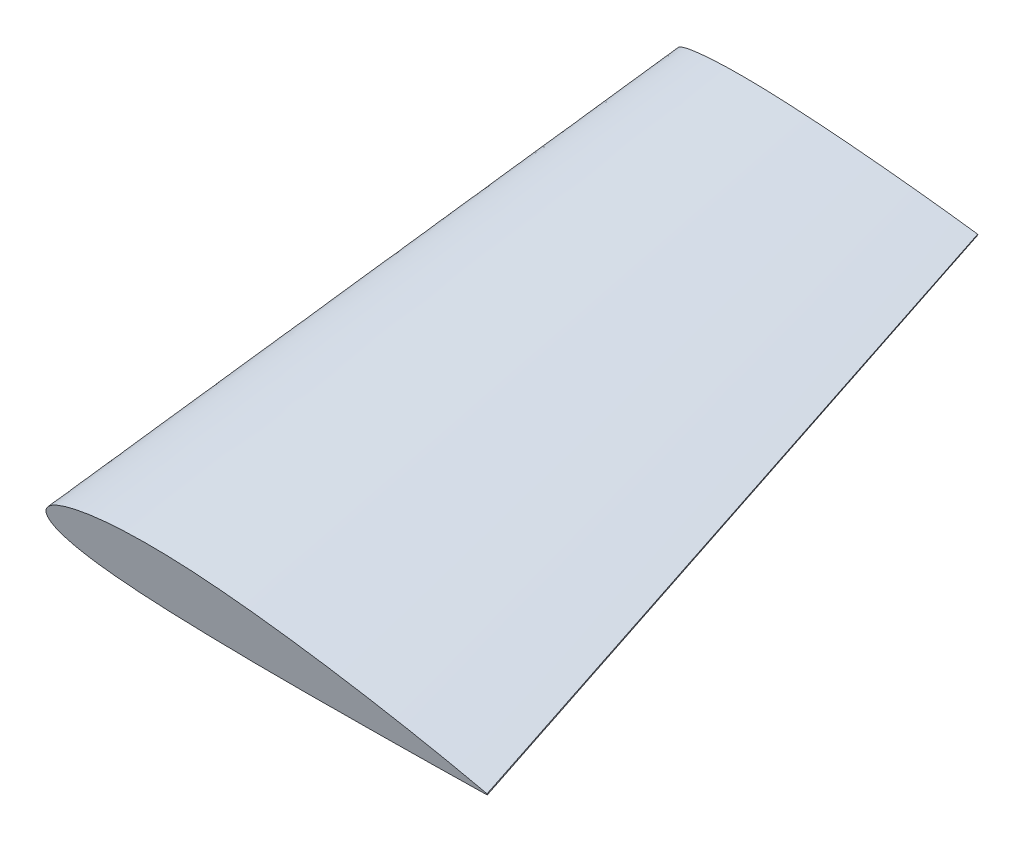
ISO-10303-21;
HEADER;
FILE_DESCRIPTION(('STEP AP214'),'2;1');
FILE_NAME('part.step','',(''),(''),'','','');
FILE_SCHEMA(('AUTOMOTIVE_DESIGN { 1 0 10303 214 1 1 1 1 }'));
ENDSEC;
DATA;
#1=APPLICATION_CONTEXT('core data for automotive mechanical design processes');
#2=APPLICATION_PROTOCOL_DEFINITION('international standard','automotive_design',2000,#1);
#3=PRODUCT_CONTEXT('',#1,'mechanical');
#4=PRODUCT('Part','Part','',(#3));
#5=PRODUCT_RELATED_PRODUCT_CATEGORY('part','',(#4));
#6=PRODUCT_DEFINITION_FORMATION('','',#4);
#7=PRODUCT_DEFINITION_CONTEXT('part definition',#1,'design');
#8=PRODUCT_DEFINITION('design','',#6,#7);
#9=PRODUCT_DEFINITION_SHAPE('','',#8);
#10=(LENGTH_UNIT() NAMED_UNIT(*) SI_UNIT(.MILLI.,.METRE.));
#11=(NAMED_UNIT(*) PLANE_ANGLE_UNIT() SI_UNIT($,.RADIAN.));
#12=(NAMED_UNIT(*) SI_UNIT($,.STERADIAN.) SOLID_ANGLE_UNIT());
#13=UNCERTAINTY_MEASURE_WITH_UNIT(LENGTH_MEASURE(1.E-05),#10,'distance_accuracy_value','');
#14=(GEOMETRIC_REPRESENTATION_CONTEXT(3) GLOBAL_UNCERTAINTY_ASSIGNED_CONTEXT((#13)) GLOBAL_UNIT_ASSIGNED_CONTEXT((#10,
#11,#12)) REPRESENTATION_CONTEXT('',''));
#15=CARTESIAN_POINT('',(0.,0.,0.));
#16=DIRECTION('',(0.,0.,1.));
#17=DIRECTION('',(1.,0.,0.));
#18=AXIS2_PLACEMENT_3D('',#15,#16,#17);
#19=CARTESIAN_POINT('',(119.746151,24.3513076251743,-66.9682199380075));
#20=DIRECTION('',(-0.997563929784599,0.0629451387922558,0.0300685133508568));
#21=DIRECTION('',(-0.069755187004952,-0.904100148364919,-0.421588822921618));
#22=AXIS2_PLACEMENT_3D('',#19,#20,#21);
#23=PLANE('',#22);
#24=DIRECTION('',(-0.0679695166424708,-0.974038223353683,-0.215939075327717));
#25=VECTOR('',#24,1.);
#26=CARTESIAN_POINT('',(120.887478722001,8.53859711326182,3.99906070157638));
#27=LINE('',#26,#25);
#28=CARTESIAN_POINT('',(119.720171777671,-8.18951629942968,0.290527241896997));
#29=VERTEX_POINT('',#28);
#30=CARTESIAN_POINT('',(119.69552466197,-8.54271626447591,0.212224694800569));
#31=VERTEX_POINT('',#30);
#32=EDGE_CURVE('E81',#29,#31,#27,.T.);
#33=ORIENTED_EDGE('',*,*,#32,.T.);
#34=DIRECTION('',(-0.000676811117803588,-0.439752151630039,0.898118915881111));
#35=VECTOR('',#34,1.);
#36=CARTESIAN_POINT('',(119.796921,57.3386746334326,-134.339302001874));
#37=LINE('',#36,#35);
#38=CARTESIAN_POINT('',(119.796921,57.3386746334326,-134.339302001874));
#39=VERTEX_POINT('',#38);
#40=EDGE_CURVE('E78',#39,#31,#37,.T.);
#41=ORIENTED_EDGE('',*,*,#40,.F.);
#42=DIRECTION('',(0.0697534354277137,0.904100259368044,0.421588874683225));
#43=VECTOR('',#42,1.);
#44=CARTESIAN_POINT('',(119.813327,57.5513189105816,-134.240144346977));
#45=LINE('',#44,#43);
#46=CARTESIAN_POINT('',(119.813327,57.5513189105816,-134.240144346977));
#47=VERTEX_POINT('',#46);
#48=EDGE_CURVE('E82',#39,#47,#45,.T.);
#49=ORIENTED_EDGE('',*,*,#48,.T.);
#50=DIRECTION('',(-0.000622136728806466,-0.439049869068138,0.89846247858057));
#51=VECTOR('',#50,1.);
#52=CARTESIAN_POINT('',(119.813327,57.5513189105816,-134.240144346977));
#53=LINE('',#52,#51);
#54=EDGE_CURVE('E59',#47,#29,#53,.T.);
#55=ORIENTED_EDGE('',*,*,#54,.T.);
#56=EDGE_LOOP('',(#33,#41,#49,#55));
#57=FACE_BOUND('',#56,.T.);
#58=ADVANCED_FACE('F43',(#57),#23,.F.);
#59=CARTESIAN_POINT('',(119.796921,57.3386746334326,-134.339302001874));
#60=CARTESIAN_POINT('',(119.695381,-8.63605938308395,0.402862125859096));
#61=CARTESIAN_POINT('',(119.720089077011,57.3372938478142,-134.339945872782));
#62=CARTESIAN_POINT('',(119.580133447658,-8.63813020899066,0.401896483880091));
#63=CARTESIAN_POINT('',(119.421762984659,57.3319324776716,-134.342445920738));
#64=CARTESIAN_POINT('',(119.132644447681,-8.64617091610578,0.398147040575329));
#65=CARTESIAN_POINT('',(118.757216412402,57.3150124086781,-134.350335878486));
#66=CARTESIAN_POINT('',(118.135824981888,-8.67155313610653,0.386311117008005));
#67=CARTESIAN_POINT('',(117.66284283727,57.2920338619605,-134.361050950794));
#68=CARTESIAN_POINT('',(116.494264736278,-8.70601902251143,0.370239410232303));
#69=CARTESIAN_POINT('',(116.148527112868,57.2600324358686,-134.375973460852));
#70=CARTESIAN_POINT('',(114.222791176919,-8.75402207823078,0.347855217735525));
#71=CARTESIAN_POINT('',(114.232196894729,57.2235601724212,-134.392980756608));
#72=CARTESIAN_POINT('',(111.348295660329,-8.80872980820112,0.322344584290083));
#73=CARTESIAN_POINT('',(111.935984539278,57.1811245159277,-134.41276882821));
#74=CARTESIAN_POINT('',(107.903976990949,-8.87238493207654,0.292661712546167));
#75=CARTESIAN_POINT('',(109.286424235353,57.1370037846587,-134.433342663084));
#76=CARTESIAN_POINT('',(103.929636690098,-8.93856574750857,0.261801091487271));
#77=CARTESIAN_POINT('',(106.313577028821,57.0927919054348,-134.453959000947));
#78=CARTESIAN_POINT('',(99.4703658606835,-9.00488254102633,0.230877062805659));
#79=CARTESIAN_POINT('',(103.051288706592,57.0471361916661,-134.475248609916));
#80=CARTESIAN_POINT('',(94.5769335764924,-9.07336807974058,0.198941731630336));
#81=CARTESIAN_POINT('',(99.5362533327051,57.0041710410815,-134.495283588668));
#82=CARTESIAN_POINT('',(89.3043799910391,-9.13781434517919,0.16888994451682));
#83=CARTESIAN_POINT('',(95.807941331968,56.9654186229173,-134.51335413803));
#84=CARTESIAN_POINT('',(83.7119118428322,-9.19594408490049,0.141783601718225));
#85=CARTESIAN_POINT('',(91.9077441613682,56.9317054664581,-134.529074841067));
#86=CARTESIAN_POINT('',(77.8616153918016,-9.24651065869062,0.118204021113229));
#87=CARTESIAN_POINT('',(87.8789595605144,56.9082228491179,-134.540024965366));
#88=CARTESIAN_POINT('',(71.8184388502869,-9.28173810923764,0.101777191145873));
#89=CARTESIAN_POINT('',(83.7657819445168,56.9006794635413,-134.543542503829));
#90=CARTESIAN_POINT('',(65.6486724152118,-9.29305045375144,0.0965021582674044));
#91=CARTESIAN_POINT('',(79.613582340364,56.9115713884137,-134.538463515849));
#92=CARTESIAN_POINT('',(59.4203736815377,-9.27671446986623,0.104119752656572));
#93=CARTESIAN_POINT('',(75.4685289214045,56.9511936167773,-134.51998736733));
#94=CARTESIAN_POINT('',(53.2027935297466,-9.21728173291146,0.131833693043693));
#95=CARTESIAN_POINT('',(71.3878041455055,57.0313101884742,-134.482628396403));
#96=CARTESIAN_POINT('',(47.0817064028677,-9.09710520830054,0.187872926800215));
#97=CARTESIAN_POINT('',(67.4141765351794,57.1365755322109,-134.43354236048));
#98=CARTESIAN_POINT('',(41.121264782632,-8.93920791728121,0.261501642804455));
#99=CARTESIAN_POINT('',(63.5881846045579,57.2704429371441,-134.371118964382));
#100=CARTESIAN_POINT('',(35.3822767744536,-8.73840563877353,0.355137283047558));
#101=CARTESIAN_POINT('',(59.9370733704736,57.4439422110186,-134.29021492429));
#102=CARTESIAN_POINT('',(29.9056098858254,-8.47815769844334,0.476492890642583));
#103=CARTESIAN_POINT('',(56.4981390961885,57.6678240616277,-134.185817102829));
#104=CARTESIAN_POINT('',(24.7472081644949,-8.14233508879882,0.633089545301414));
#105=CARTESIAN_POINT('',(53.306583026596,57.9470777960337,-134.055598947907));
#106=CARTESIAN_POINT('',(19.9598742758701,-7.72345548053181,0.828416314481281));
#107=CARTESIAN_POINT('',(50.3951572901005,58.2880798953984,-133.896587057527));
#108=CARTESIAN_POINT('',(15.5927358514262,-7.21195117989352,1.06693468704812));
#109=CARTESIAN_POINT('',(47.7944372518907,58.6937491708061,-133.707420367726));
#110=CARTESIAN_POINT('',(11.6916562954461,-6.60344534011803,1.35068562016747));
#111=CARTESIAN_POINT('',(45.5309277851159,59.1622751520439,-133.48894311463));
#112=CARTESIAN_POINT('',(8.29639119290956,-5.90065956438362,1.67840000943481));
#113=CARTESIAN_POINT('',(43.6283920681246,59.6931133204905,-133.241409211443));
#114=CARTESIAN_POINT('',(5.44258821000201,-5.10440002788183,2.04970192918454));
#115=CARTESIAN_POINT('',(42.1035247735245,60.2832605728656,-132.966219028221));
#116=CARTESIAN_POINT('',(3.15528662789996,-4.21918090958475,2.46248638319166));
#117=CARTESIAN_POINT('',(40.9645845449649,60.930341308061,-132.664480325955));
#118=CARTESIAN_POINT('',(1.44687693909117,-3.2485582938912,2.91509514206799));
#119=CARTESIAN_POINT('',(40.2106547036615,61.6585537089717,-132.324909306647));
#120=CARTESIAN_POINT('',(0.315982361489284,-2.15624024344861,3.42445141413029));
#121=CARTESIAN_POINT('',(39.9162153889077,62.500238794225,-131.932425105638));
#122=CARTESIAN_POINT('',(-0.125677219466628,-0.89371255866906,4.01317774217567));
#123=CARTESIAN_POINT('',(40.1556330428731,63.3578335394647,-131.532522108339));
#124=CARTESIAN_POINT('',(0.233450762508598,0.392678834123395,4.61303190001945));
#125=CARTESIAN_POINT('',(40.8708763287822,64.1244234606476,-131.175055357427));
#126=CARTESIAN_POINT('',(1.30631319626383,1.54256510941787,5.14923267619657));
#127=CARTESIAN_POINT('',(41.986695646897,64.8252672810364,-130.84824651681));
#128=CARTESIAN_POINT('',(2.9800433907782,2.59382997944545,5.63944553583974));
#129=CARTESIAN_POINT('',(43.5103075643543,65.4739885588415,-130.545742816961));
#130=CARTESIAN_POINT('',(5.26546161540701,3.56691151489644,6.09320090782974));
#131=CARTESIAN_POINT('',(45.4347150322575,66.0603540394751,-130.272316102864));
#132=CARTESIAN_POINT('',(8.1520728952497,4.44645964518702,6.50334093670014));
#133=CARTESIAN_POINT('',(47.7453694398953,66.5703185981993,-130.034515723743));
#134=CARTESIAN_POINT('',(11.6180537630873,5.21140885743658,6.86004261247173));
#135=CARTESIAN_POINT('',(50.41954469606,66.9847004094938,-129.841286311736));
#136=CARTESIAN_POINT('',(15.6293171010849,5.83297866604579,7.14988537430413));
#137=CARTESIAN_POINT('',(53.4269982165544,67.291297938032,-129.698317536208));
#138=CARTESIAN_POINT('',(20.140497454147,6.29287572022958,7.36433889263295));
#139=CARTESIAN_POINT('',(56.7334090785526,67.4734763032948,-129.613366369335));
#140=CARTESIAN_POINT('',(25.1001141297721,6.56614309482602,7.49176556213118));
#141=CARTESIAN_POINT('',(60.299715648689,67.526568615808,-129.588609017421));
#142=CARTESIAN_POINT('',(30.4495739660976,6.64578150412717,7.52890156227159));
#143=CARTESIAN_POINT('',(64.0839236547042,67.4434184585075,-129.627382572547));
#144=CARTESIAN_POINT('',(36.1258856305697,6.5210567694952,7.47074146335135));
#145=CARTESIAN_POINT('',(68.0413704755695,67.224417004732,-129.72950462759));
#146=CARTESIAN_POINT('',(42.0620559623822,6.19255546464568,7.31755878918611));
#147=CARTESIAN_POINT('',(72.1128083068471,66.8712121858612,-129.894206739527));
#148=CARTESIAN_POINT('',(48.1692120249969,5.66274652337062,7.07050482251057));
#149=CARTESIAN_POINT('',(76.2514681863848,66.4040688633658,-130.112039248262));
#150=CARTESIAN_POINT('',(54.3772018868441,4.96203282514679,6.7437566588547));
#151=CARTESIAN_POINT('',(80.4133766567728,65.8549897466314,-130.368079045328));
#152=CARTESIAN_POINT('',(60.6200639533861,4.13841260461048,6.35969624260732));
#153=CARTESIAN_POINT('',(84.5647854813308,65.2357505888345,-130.656835006838));
#154=CARTESIAN_POINT('',(66.8471778222922,3.20955625405147,5.92656341301577));
#155=CARTESIAN_POINT('',(88.6603769940206,64.5574695850986,-130.973122633262));
#156=CARTESIAN_POINT('',(72.990565092582,2.19213236807685,5.452130863396));
#157=CARTESIAN_POINT('',(92.6565544288856,63.8398623991482,-131.307748359617));
#158=CARTESIAN_POINT('',(78.9848320738078,1.11572302870036,4.95019294513519));
#159=CARTESIAN_POINT('',(96.5094641766712,63.0964777294619,-131.654394324047));
#160=CARTESIAN_POINT('',(84.764196939048,0.000645734516559844,4.43022386342255));
#161=CARTESIAN_POINT('',(100.17776634055,62.3428917568158,-132.00579723417));
#162=CARTESIAN_POINT('',(90.2666500704411,-1.12973316370068,3.90311952656706));
#163=CARTESIAN_POINT('',(103.622345902392,61.5961739013321,-132.353997488663));
#164=CARTESIAN_POINT('',(95.4335189038481,-2.24981032279298,3.38081896955784));
#165=CARTESIAN_POINT('',(106.806987105637,60.8712387811388,-132.692040286875));
#166=CARTESIAN_POINT('',(100.210480041861,-3.33721414968347,2.87375423757177));
#167=CARTESIAN_POINT('',(109.698241242375,60.185033521575,-133.012023054476));
#168=CARTESIAN_POINT('',(104.547361928777,-4.36652025959726,2.39378091593326));
#169=CARTESIAN_POINT('',(112.265941349969,59.5515929178496,-133.307401258979));
#170=CARTESIAN_POINT('',(108.398911724082,-5.31668209062881,1.95071317763668));
#171=CARTESIAN_POINT('',(114.48401058316,58.9863152622602,-133.570994558764));
#172=CARTESIAN_POINT('',(111.726015897125,-6.16459769668113,1.55532363706536));
#173=CARTESIAN_POINT('',(116.329109586423,58.5010825277008,-133.797262298877));
#174=CARTESIAN_POINT('',(114.493663788704,-6.89244802920554,1.21592145301857));
#175=CARTESIAN_POINT('',(117.784271886205,58.1111987262695,-133.979068101275));
#176=CARTESIAN_POINT('',(116.676407838735,-7.47727241520905,0.943213363149353));
#177=CARTESIAN_POINT('',(118.83319885077,57.8230751894075,-134.113422313008));
#178=CARTESIAN_POINT('',(118.249798126664,-7.90945852529748,0.741681670266907));
#179=CARTESIAN_POINT('',(119.465681012099,57.6515774897992,-134.193393003692));
#180=CARTESIAN_POINT('',(119.198521990126,-8.16670407352438,0.621726101102423));
#181=CARTESIAN_POINT('',(119.745098710523,57.5709954539719,-134.230969024108));
#182=CARTESIAN_POINT('',(119.617648410054,-8.28757827200148,0.56536153667921));
#183=CARTESIAN_POINT('',(119.813327,57.5513189105816,-134.240144346977));
#184=CARTESIAN_POINT('',(119.719991,-8.31709342051427,0.551598396896114));
#185=B_SPLINE_SURFACE_WITH_KNOTS('',3,1,((#59,#60),(#61,#62),(#63,#64),(#65,#66),(#67,#68),(#69,
#70),(#71,#72),(#73,#74),(#75,#76),(#77,#78),(#79,#80),(#81,#82),(#83,#84),(#85,#86),(#87,#88),
(#89,#90),(#91,#92),(#93,#94),(#95,#96),(#97,#98),(#99,#100),(#101,#102),(#103,#104),(#105,
#106),(#107,#108),(#109,#110),(#111,#112),(#113,#114),(#115,#116),(#117,#118),(#119,#120),(#121,
#122),(#123,#124),(#125,#126),(#127,#128),(#129,#130),(#131,#132),(#133,#134),(#135,#136),(#137,
#138),(#139,#140),(#141,#142),(#143,#144),(#145,#146),(#147,#148),(#149,#150),(#151,#152),(#153,
#154),(#155,#156),(#157,#158),(#159,#160),(#161,#162),(#163,#164),(#165,#166),(#167,#168),(#169,
#170),(#171,#172),(#173,#174),(#175,#176),(#177,#178),(#179,#180),(#181,#182),(#183,#184)),
.UNSPECIFIED.,.F.,.F.,.F.,(4,1,1,1,1,1,1,1,1,1,1,1,1,1,1,1,1,1,1,1,1,1,1,1,1,1,1,1,1,1,1,1,1,1,
1,1,1,1,1,1,1,1,1,1,1,1,1,1,1,1,1,1,1,1,1,1,1,1,1,1,4),(2,2),(0.,0.00140426639984959,
0.00545255629466779,0.0121483441268653,0.0214077993242185,0.0331320979429333,0.0471743381029762,
0.063376631995686,0.0815572838841061,0.101506317964811,0.122997537633434,0.145795502458062,
0.169640520657042,0.19427144542702,0.219417320947617,0.244803050944842,0.270147100785102,
0.295165349773602,0.319388981425358,0.342790032185736,0.365130697804628,0.386196622663306,
0.40578881072802,0.423715600027115,0.439829198130156,0.453994653991293,0.466115133872475,
0.47616233382913,0.484210204133662,0.490546973712714,0.495899701559383,0.501250622448549,
0.507608162128308,0.515724252713546,0.525914787285248,0.538268455651865,0.552769477827439,
0.569329859155209,0.587812276369091,0.608046386738343,0.629838472377957,0.652971156465722,
0.677200621541474,0.702274678093705,0.727698166522235,0.753405905054719,0.779124875485229,
0.80457568680284,0.829483129372504,0.853566604409608,0.876557773414219,0.898214996265898,
0.91828564740033,0.936559103667118,0.952829355966221,0.966913380007166,0.97866270037821,
0.987936590949606,0.994641798372105,0.998691630481928,1.),(0.,1.),.UNSPECIFIED.);
#186=CARTESIAN_POINT('',(119.813327,57.5513189105816,-134.240144346977));
#187=CARTESIAN_POINT('',(119.745098710523,57.5709954539719,-134.230969024108));
#188=CARTESIAN_POINT('',(119.465681012099,57.6515774897992,-134.193393003692));
#189=CARTESIAN_POINT('',(118.83319885077,57.8230751894075,-134.113422313008));
#190=CARTESIAN_POINT('',(117.784271886205,58.1111987262695,-133.979068101275));
#191=CARTESIAN_POINT('',(116.329109586423,58.5010825277008,-133.797262298877));
#192=CARTESIAN_POINT('',(114.48401058316,58.9863152622602,-133.570994558764));
#193=CARTESIAN_POINT('',(112.265941349969,59.5515929178496,-133.307401258979));
#194=CARTESIAN_POINT('',(109.698241242375,60.185033521575,-133.012023054476));
#195=CARTESIAN_POINT('',(106.806987105637,60.8712387811388,-132.692040286875));
#196=CARTESIAN_POINT('',(103.622345902392,61.5961739013321,-132.353997488663));
#197=CARTESIAN_POINT('',(100.17776634055,62.3428917568158,-132.00579723417));
#198=CARTESIAN_POINT('',(96.5094641766712,63.0964777294619,-131.654394324047));
#199=CARTESIAN_POINT('',(92.6565544288856,63.8398623991482,-131.307748359617));
#200=CARTESIAN_POINT('',(88.6603769940206,64.5574695850986,-130.973122633262));
#201=CARTESIAN_POINT('',(84.5647854813308,65.2357505888345,-130.656835006838));
#202=CARTESIAN_POINT('',(80.4133766567728,65.8549897466314,-130.368079045328));
#203=CARTESIAN_POINT('',(76.2514681863848,66.4040688633658,-130.112039248262));
#204=CARTESIAN_POINT('',(72.1128083068471,66.8712121858612,-129.894206739527));
#205=CARTESIAN_POINT('',(68.0413704755695,67.224417004732,-129.72950462759));
#206=CARTESIAN_POINT('',(64.0839236547042,67.4434184585075,-129.627382572547));
#207=CARTESIAN_POINT('',(60.299715648689,67.526568615808,-129.588609017421));
#208=CARTESIAN_POINT('',(56.7334090785526,67.4734763032948,-129.613366369335));
#209=CARTESIAN_POINT('',(53.4269982165544,67.291297938032,-129.698317536208));
#210=CARTESIAN_POINT('',(50.41954469606,66.9847004094938,-129.841286311736));
#211=CARTESIAN_POINT('',(47.7453694398953,66.5703185981993,-130.034515723743));
#212=CARTESIAN_POINT('',(45.4347150322575,66.0603540394751,-130.272316102864));
#213=CARTESIAN_POINT('',(43.5103075643543,65.4739885588415,-130.545742816961));
#214=CARTESIAN_POINT('',(41.986695646897,64.8252672810364,-130.84824651681));
#215=CARTESIAN_POINT('',(40.8708763287822,64.1244234606476,-131.175055357427));
#216=CARTESIAN_POINT('',(40.1556330428731,63.3578335394647,-131.532522108339));
#217=CARTESIAN_POINT('',(39.9162153889077,62.500238794225,-131.932425105638));
#218=CARTESIAN_POINT('',(40.2106547036615,61.6585537089717,-132.324909306647));
#219=CARTESIAN_POINT('',(40.9645845449649,60.930341308061,-132.664480325955));
#220=CARTESIAN_POINT('',(42.1035247735245,60.2832605728656,-132.966219028221));
#221=CARTESIAN_POINT('',(43.6283920681246,59.6931133204905,-133.241409211443));
#222=CARTESIAN_POINT('',(45.5309277851159,59.1622751520439,-133.48894311463));
#223=CARTESIAN_POINT('',(47.7944372518907,58.6937491708061,-133.707420367726));
#224=CARTESIAN_POINT('',(50.3951572901005,58.2880798953984,-133.896587057527));
#225=CARTESIAN_POINT('',(53.306583026596,57.9470777960337,-134.055598947907));
#226=CARTESIAN_POINT('',(56.4981390961885,57.6678240616277,-134.185817102829));
#227=CARTESIAN_POINT('',(59.9370733704736,57.4439422110186,-134.29021492429));
#228=CARTESIAN_POINT('',(63.5881846045579,57.2704429371441,-134.371118964382));
#229=CARTESIAN_POINT('',(67.4141765351794,57.1365755322109,-134.43354236048));
#230=CARTESIAN_POINT('',(71.3878041455055,57.0313101884742,-134.482628396403));
#231=CARTESIAN_POINT('',(75.4685289214045,56.9511936167773,-134.51998736733));
#232=CARTESIAN_POINT('',(79.613582340364,56.9115713884137,-134.538463515849));
#233=CARTESIAN_POINT('',(83.7657819445168,56.9006794635413,-134.543542503829));
#234=CARTESIAN_POINT('',(87.8789595605144,56.9082228491179,-134.540024965366));
#235=CARTESIAN_POINT('',(91.9077441613682,56.9317054664581,-134.529074841067));
#236=CARTESIAN_POINT('',(95.807941331968,56.9654186229173,-134.51335413803));
#237=CARTESIAN_POINT('',(99.5362533327051,57.0041710410815,-134.495283588668));
#238=CARTESIAN_POINT('',(103.051288706592,57.0471361916661,-134.475248609916));
#239=CARTESIAN_POINT('',(106.313577028821,57.0927919054348,-134.453959000947));
#240=CARTESIAN_POINT('',(109.286424235353,57.1370037846587,-134.433342663084));
#241=CARTESIAN_POINT('',(111.935984539278,57.1811245159277,-134.41276882821));
#242=CARTESIAN_POINT('',(114.232196894729,57.2235601724212,-134.392980756608));
#243=CARTESIAN_POINT('',(116.148527112868,57.2600324358686,-134.375973460852));
#244=CARTESIAN_POINT('',(117.66284283727,57.2920338619605,-134.361050950794));
#245=CARTESIAN_POINT('',(118.757216412402,57.3150124086781,-134.350335878486));
#246=CARTESIAN_POINT('',(119.421762984659,57.3319324776716,-134.342445920738));
#247=CARTESIAN_POINT('',(119.720089077011,57.3372938478142,-134.339945872782));
#248=CARTESIAN_POINT('',(119.796921,57.3386746334326,-134.339302001874));
#249=B_SPLINE_CURVE_WITH_KNOTS('',3,(#186,#187,#188,#189,#190,#191,#192,#193,#194,#195,#196,
#197,#198,#199,#200,#201,#202,#203,#204,#205,#206,#207,#208,#209,#210,#211,#212,#213,#214,#215,
#216,#217,#218,#219,#220,#221,#222,#223,#224,#225,#226,#227,#228,#229,#230,#231,#232,#233,#234,
#235,#236,#237,#238,#239,#240,#241,#242,#243,#244,#245,#246,#247,#248),.UNSPECIFIED.,.F.,.F.,(4,
1,1,1,1,1,1,1,1,1,1,1,1,1,1,1,1,1,1,1,1,1,1,1,1,1,1,1,1,1,1,1,1,1,1,1,1,1,1,1,1,1,1,1,1,1,1,1,1,
1,1,1,1,1,1,1,1,1,1,1,4),(0.,0.00130836635657932,0.00535819846656844,0.0120634058893427,
0.0213372950911126,0.0330866148974405,0.0471706433979654,0.0634408912462413,0.0817143485429148,
0.101785001152944,0.123442225507798,0.146433395590392,0.170516869545728,0.195424308527528,
0.220875119117892,0.246594088204854,0.27230182644665,0.297725321169948,0.322799373298068,
0.347028842550705,0.370161526686606,0.391953612327114,0.412187722697197,0.43067013587736,
0.447230518252345,0.461731544348135,0.474085209227469,0.48427574286232,0.492391834645729,
0.498749373591418,0.504100296008657,0.50945302580549,0.515789792521623,0.52383766617087,
0.533884862291248,0.546005345432156,0.560170800701887,0.576284396104929,0.594211188901509,
0.613803377165532,0.634869302172798,0.657209963846083,0.680611018574642,0.70483464820832,
0.729852893052271,0.75519694900701,0.780582676988478,0.80572855457298,0.830359479281498,
0.854204497541938,0.877002456273256,0.898493680030599,0.918442712019848,0.936623363942717,
0.95282565986615,0.9668678999448,0.978592194504115,0.987851651731716,0.994547441643141,
0.998595729456764,1.),.UNSPECIFIED.);
#250=EDGE_CURVE('E70',#47,#39,#249,.T.);
#251=CARTESIAN_POINT('',(119.720171777671,-8.18951629942968,0.290527241896997));
#252=CARTESIAN_POINT('',(119.682011862439,-8.17732486126336,0.293230018668413));
#253=CARTESIAN_POINT('',(119.643852419115,-8.16513183169179,0.295933148245879));
#254=CARTESIAN_POINT('',(119.567518355628,-8.14079077391738,0.30132943083755));
#255=CARTESIAN_POINT('',(119.529343735417,-8.12864274585608,0.304022583820375));
#256=CARTESIAN_POINT('',(119.452964115157,-8.10444016735785,0.309388166295629));
#257=CARTESIAN_POINT('',(119.414759115659,-8.09238561526517,0.312060596155129));
#258=CARTESIAN_POINT('',(119.338309414249,-8.06839732846219,0.317378671305297));
#259=CARTESIAN_POINT('',(119.300064712399,-8.05646359356874,0.320024316636571));
#260=CARTESIAN_POINT('',(119.185284144146,-8.02081144931929,0.32792820672845));
#261=CARTESIAN_POINT('',(119.108699912114,-7.99724149846271,0.333153539032109));
#262=CARTESIAN_POINT('',(118.955444323165,-7.95037255405629,0.343544133850722));
#263=CARTESIAN_POINT('',(118.87877296582,-7.92707356184019,0.348709396069991));
#264=CARTESIAN_POINT('',(118.725384590885,-7.88062098834096,0.359007683680798));
#265=CARTESIAN_POINT('',(118.648667573547,-7.85746740626288,0.364140709248574));
#266=CARTESIAN_POINT('',(118.49523357753,-7.81116062463915,0.374406675578725));
#267=CARTESIAN_POINT('',(118.418516598851,-7.78800742509291,0.379539616341235));
#268=CARTESIAN_POINT('',(118.188387839244,-7.71847402845557,0.394954799251167));
#269=CARTESIAN_POINT('',(118.034999347572,-7.67202036804986,0.405253327823341));
#270=CARTESIAN_POINT('',(117.72822272972,-7.57908779440366,0.425855983386373));
#271=CARTESIAN_POINT('',(117.574834603878,-7.53260888010469,0.436160110611894));
#272=CARTESIAN_POINT('',(117.268028686261,-7.43974551293173,0.456747423469189));
#273=CARTESIAN_POINT('',(117.114610894554,-7.39336105984609,0.46703060914789));
#274=CARTESIAN_POINT('',(116.65423809528,-7.25458086505628,0.497797437613334));
#275=CARTESIAN_POINT('',(116.347164843475,-7.1625586477056,0.518198272044539));
#276=CARTESIAN_POINT('',(115.732707101145,-6.9793742464009,0.558809276093234));
#277=CARTESIAN_POINT('',(115.425322576128,-6.88821217284901,0.579019421235157));
#278=CARTESIAN_POINT('',(114.810355598084,-6.70652637717675,0.619298192413736));
#279=CARTESIAN_POINT('',(114.502773144892,-6.61600265559362,0.639366818331289));
#280=CARTESIAN_POINT('',(113.579751153644,-6.3453228521322,0.699375086043921));
#281=CARTESIAN_POINT('',(112.964036757873,-6.16605806430005,0.739117132706128));
#282=CARTESIAN_POINT('',(111.73168031644,-5.81057995421876,0.817924732397549));
#283=CARTESIAN_POINT('',(111.115038265603,-5.63436664906721,0.856990281636317));
#284=CARTESIAN_POINT('',(109.880879149434,-5.28488690099267,0.934468076486239));
#285=CARTESIAN_POINT('',(109.263362083968,-5.11162045852704,0.972880321995999));
#286=CARTESIAN_POINT('',(108.027605872214,-4.76777196842112,1.04910969701031));
#287=CARTESIAN_POINT('',(107.409366797433,-4.59718967576341,1.08692688083392));
#288=CARTESIAN_POINT('',(106.172115547931,-4.25871926033137,1.16196396539774));
#289=CARTESIAN_POINT('',(105.553103373518,-4.09083113648141,1.19918386637641));
#290=CARTESIAN_POINT('',(104.314307450816,-3.75777310276794,1.27302105480104));
#291=CARTESIAN_POINT('',(103.694523696955,-3.59260321266034,1.30963833786721));
#292=CARTESIAN_POINT('',(102.454217260856,-3.26492807199017,1.38228216763457));
#293=CARTESIAN_POINT('',(101.833694577877,-3.10242282410359,1.41830871374249));
#294=CARTESIAN_POINT('',(100.384827038029,-2.72621196975097,1.5017126521808));
#295=CARTESIAN_POINT('',(99.556208426393,-2.51351051920872,1.54886742850243));
#296=CARTESIAN_POINT('',(97.8977442221683,-2.09271621527874,1.64215527975425));
#297=CARTESIAN_POINT('',(97.0678986290759,-1.88462336378143,1.68828835426535));
#298=CARTESIAN_POINT('',(95.4069658152783,-1.47315990282839,1.77950760743123));
#299=CARTESIAN_POINT('',(94.5758785754491,-1.26978936692076,1.82459376978078));
#300=CARTESIAN_POINT('',(92.9125072443845,-0.86777296969915,1.91371865933976));
#301=CARTESIAN_POINT('',(92.0802231529515,-0.669127109165039,1.95775738637628));
#302=CARTESIAN_POINT('',(89.5816375414473,-0.0801796241875988,2.08832390037276));
#303=CARTESIAN_POINT('',(87.9136011529234,0.303132282752189,2.1733021042688));
#304=CARTESIAN_POINT('',(84.5714645038029,1.05059000943469,2.33900949282553));
#305=CARTESIAN_POINT('',(82.8973601720202,1.41471849599034,2.41973483481116));
#306=CARTESIAN_POINT('',(80.3828438719596,1.94568141888968,2.53744648087924));
#307=CARTESIAN_POINT('',(79.5441128969079,2.12013054191541,2.57612092035678));
#308=CARTESIAN_POINT('',(77.8655437024502,2.46388196591369,2.65232877633311));
#309=CARTESIAN_POINT('',(77.0257054828101,2.63318426579768,2.68986219259057));
#310=CARTESIAN_POINT('',(75.3449491604743,2.96657973263019,2.76377418813668));
#311=CARTESIAN_POINT('',(74.5040310626786,3.13067292312909,2.80015277264634));
#312=CARTESIAN_POINT('',(72.8211377949584,3.45361277221167,2.87174681354266));
#313=CARTESIAN_POINT('',(71.9791626243745,3.61245942752126,2.90696226920348));
#314=CARTESIAN_POINT('',(70.2201932752817,3.93826697299664,2.97919206308417));
#315=CARTESIAN_POINT('',(69.3030996102124,4.10471671192786,3.01609308180353));
#316=CARTESIAN_POINT('',(67.4675849115224,4.43048916682279,3.08831509628982));
#317=CARTESIAN_POINT('',(66.549163878515,4.58981188607825,3.12363609278651));
#318=CARTESIAN_POINT('',(64.7109751111289,4.90103642672077,3.19263291233046));
#319=CARTESIAN_POINT('',(63.7912073395087,5.05293803874067,3.22630868896213));
#320=CARTESIAN_POINT('',(61.9503999527667,5.34918532158574,3.29198513039135));
#321=CARTESIAN_POINT('',(61.0293603369164,5.49353098808061,3.3239857942289));
#322=CARTESIAN_POINT('',(58.2640518297119,5.91491901982205,3.41740527176759));
#323=CARTESIAN_POINT('',(56.4178839589679,6.180263069272,3.4762306312947));
#324=CARTESIAN_POINT('',(53.6445867333912,6.55215508676274,3.55867710665191));
#325=CARTESIAN_POINT('',(52.7192826543424,6.67178777032299,3.58519903407487));
#326=CARTESIAN_POINT('',(50.8673213941291,6.90068230219745,3.63594373009959));
#327=CARTESIAN_POINT('',(49.9406642164044,7.0099441768291,3.66016650453579));
#328=CARTESIAN_POINT('',(48.0857115587074,7.21656843782699,3.70597400037156));
#329=CARTESIAN_POINT('',(47.1574157176609,7.31392774608943,3.72755803937195));
#330=CARTESIAN_POINT('',(45.2994576949402,7.49537163466306,3.76778318103791));
#331=CARTESIAN_POINT('',(44.3697955146836,7.57945622873909,3.78642428675506));
#332=CARTESIAN_POINT('',(42.5093221777648,7.73296276194369,3.82045586584734));
#333=CARTESIAN_POINT('',(41.5785111936534,7.80238668418327,3.83584677886759));
#334=CARTESIAN_POINT('',(39.7158024410164,7.92565047619067,3.86317370365276));
#335=CARTESIAN_POINT('',(38.7839046715603,7.979490332606,3.8751097124575));
#336=CARTESIAN_POINT('',(36.919813574862,8.0708819663351,3.89537074986546));
#337=CARTESIAN_POINT('',(35.9876207401083,8.10844326157395,3.90369788854187));
#338=CARTESIAN_POINT('',(34.1226514749835,8.16617398377539,3.91649648152445));
#339=CARTESIAN_POINT('',(33.1898750388187,8.1863432352449,3.92096789692474));
#340=CARTESIAN_POINT('',(31.3245497002258,8.20793205857791,3.92575402383041));
#341=CARTESIAN_POINT('',(30.3920009136016,8.20936090334502,3.92607079108903));
#342=CARTESIAN_POINT('',(28.5271150486271,8.19200762507955,3.92222366191822));
#343=CARTESIAN_POINT('',(27.594777963076,8.17322634398168,3.91805995214121));
#344=CARTESIAN_POINT('',(26.29096914708,8.1316988549434,3.90885352946847));
#345=CARTESIAN_POINT('',(25.919176880651,8.11811931229165,3.90584301734145));
#346=CARTESIAN_POINT('',(25.1757521345809,8.08737503023776,3.89902717410331));
#347=CARTESIAN_POINT('',(24.8041196533832,8.07021032659646,3.89522185092019));
#348=CARTESIAN_POINT('',(23.6894871903654,8.01302582843758,3.88254435289245));
#349=CARTESIAN_POINT('',(22.946777265172,7.96731642039337,3.87241082109648));
#350=CARTESIAN_POINT('',(21.8336501000734,7.88620670547872,3.85442923021141));
#351=CARTESIAN_POINT('',(21.4627431004386,7.8570772027199,3.84797137492434));
#352=CARTESIAN_POINT('',(20.7213137942926,7.79444790698429,3.83408679433467));
#353=CARTESIAN_POINT('',(20.3507914874434,7.76094811785043,3.82666006988403));
#354=CARTESIAN_POINT('',(19.6100981324017,7.68933695479312,3.81078425724857));
#355=CARTESIAN_POINT('',(19.2399272288472,7.65122415338684,3.80233485259843));
#356=CARTESIAN_POINT('',(18.500140251559,7.57015824496748,3.78436297337955));
#357=CARTESIAN_POINT('',(18.1305241782327,7.52720513440245,3.77484049802338));
#358=CARTESIAN_POINT('',(17.3936105807986,7.43642283463589,3.75471454670268));
#359=CARTESIAN_POINT('',(17.0263101105186,7.38861647101385,3.7441161310473));
#360=CARTESIAN_POINT('',(16.2924618012588,7.28777087406212,3.72175920045206));
#361=CARTESIAN_POINT('',(15.9259139627134,7.23473163771337,3.71000068484289));
#362=CARTESIAN_POINT('',(15.1937253796605,7.12298928604853,3.68522800188763));
#363=CARTESIAN_POINT('',(14.8280846277212,7.06428621729466,3.67221384486413));
#364=CARTESIAN_POINT('',(14.0978974492585,6.94070129745882,3.64481572775337));
#365=CARTESIAN_POINT('',(13.733351021465,6.87581945355133,3.63043176925665));
#366=CARTESIAN_POINT('',(13.0056298454953,6.7394111668833,3.60019078016208));
#367=CARTESIAN_POINT('',(12.6424548625951,6.66788592028081,3.58433401474609));
#368=CARTESIAN_POINT('',(11.9176488088453,6.51769619913069,3.55103775518328));
#369=CARTESIAN_POINT('',(11.5560177488743,6.43903167436561,3.53359824990351));
#370=CARTESIAN_POINT('',(10.8345114501412,6.27366819406883,3.49693804892566));
#371=CARTESIAN_POINT('',(10.4746370667027,6.18696566970505,3.47771656203654));
#372=CARTESIAN_POINT('',(9.75724092428335,6.00471609255966,3.43731280351447));
#373=CARTESIAN_POINT('',(9.39971911383219,5.90916923397095,3.41613057493305));
#374=CARTESIAN_POINT('',(8.86323289538265,5.75799730964758,3.3826165661691));
#375=CARTESIAN_POINT('',(8.6832102612031,5.70593685021252,3.37107504017761));
#376=CARTESIAN_POINT('',(8.32399319251395,5.59916232710311,3.34740369829801));
#377=CARTESIAN_POINT('',(8.14479875830864,5.54444826245387,3.33527388219378));
#378=CARTESIAN_POINT('',(7.60860707022602,5.37590475990282,3.29790868725506));
#379=CARTESIAN_POINT('',(7.25303640753287,5.25768375835938,3.27169972220058));
#380=CARTESIAN_POINT('',(6.54746972572965,5.0078672091724,3.21631672660595));
#381=CARTESIAN_POINT('',(6.19746601470345,4.87629238622579,3.1871472906205));
#382=CARTESIAN_POINT('',(5.50398449869739,4.59771778744124,3.12538878892206));
#383=CARTESIAN_POINT('',(5.16050444931507,4.45072343438731,3.09280092541135));
#384=CARTESIAN_POINT('',(4.70933099237391,4.24144112720617,3.0464041549237));
#385=CARTESIAN_POINT('',(4.59726747360276,4.1880947838904,3.03457755533908));
#386=CARTESIAN_POINT('',(4.37435887362462,4.07902808064776,3.01039804935813));
#387=CARTESIAN_POINT('',(4.26351376574684,4.02330777281724,2.99804515451128));
#388=CARTESIAN_POINT('',(4.04315170558168,3.9093147762879,2.97277351560205));
#389=CARTESIAN_POINT('',(3.93363529376801,3.85104109064822,2.9598545505232));
#390=CARTESIAN_POINT('',(3.71611817781412,3.7318517209932,2.93343090342691));
#391=CARTESIAN_POINT('',(3.60811749896294,3.67093599296627,2.91992621165233));
#392=CARTESIAN_POINT('',(3.39401081488934,3.54630770332499,2.89229678502454));
#393=CARTESIAN_POINT('',(3.28790244072367,3.482599043175,2.87817291510515));
#394=CARTESIAN_POINT('',(3.07785583577712,3.35187079198547,2.84919115955979));
#395=CARTESIAN_POINT('',(2.97391763755233,3.28485115132666,2.83433326293348));
#396=CARTESIAN_POINT('',(2.66611558359632,3.07832725661352,2.78854801776735));
#397=CARTESIAN_POINT('',(2.46606298276976,2.93324328154739,2.75638367486017));
#398=CARTESIAN_POINT('',(2.18104699286826,2.70605858321185,2.70601803980503));
#399=CARTESIAN_POINT('',(2.09049093775872,2.63058796402406,2.68928660634474));
#400=CARTESIAN_POINT('',(1.91307924086016,2.47556044529099,2.65491783287884));
#401=CARTESIAN_POINT('',(1.82622407197928,2.3960030263723,2.63728037773092));
#402=CARTESIAN_POINT('',(1.65733703403064,2.23227590136139,2.60098294798613));
#403=CARTESIAN_POINT('',(1.57530054316873,2.14811076956207,2.58232398748558));
#404=CARTESIAN_POINT('',(1.41733337962808,1.97447639537878,2.5438301734778));
#405=CARTESIAN_POINT('',(1.34140096904251,1.8850086754,2.52399565747967));
#406=CARTESIAN_POINT('',(1.20996383254227,1.71669404369336,2.48668120198559));
#407=CARTESIAN_POINT('',(1.15322233899967,1.63877033339061,2.46940593131815));
#408=CARTESIAN_POINT('',(1.04588373701373,1.4789385476706,2.43397207750333));
#409=CARTESIAN_POINT('',(0.995287772259353,1.39702973458201,2.41581333081817));
#410=CARTESIAN_POINT('',(0.901296220518763,1.22939302638713,2.37864916734834));
#411=CARTESIAN_POINT('',(0.857897807698852,1.14366664694581,2.35964408657849));
#412=CARTESIAN_POINT('',(0.778919117417438,0.968883612267586,2.32089562066979));
#413=CARTESIAN_POINT('',(0.743334605116321,0.879828791698824,2.30115264226707));
#414=CARTESIAN_POINT('',(0.68776158946777,0.719158696534873,2.26553293972289));
#415=CARTESIAN_POINT('',(0.666065057301466,0.648104642034375,2.249780635081));
#416=CARTESIAN_POINT('',(0.62830567718697,0.504583876179361,2.21796284731252));
#417=CARTESIAN_POINT('',(0.612242012489792,0.43211737123574,2.20189740994613));
#418=CARTESIAN_POINT('',(0.586297403795963,0.286223401628861,2.16955349557249));
#419=CARTESIAN_POINT('',(0.576407399337424,0.212797507427349,2.15327536672823));
#420=CARTESIAN_POINT('',(0.566611559885321,0.102251519564688,2.12876791124249));
#421=CARTESIAN_POINT('',(0.564186144302209,0.0653338094984373,2.1205834519638));
#422=CARTESIAN_POINT('',(0.561097028709455,-0.00857168321093466,2.10419899869014));
#423=CARTESIAN_POINT('',(0.56043333653236,-0.0455594661648653,2.09599900462626));
#424=CARTESIAN_POINT('',(0.561063560851131,-0.156699994434619,2.07135974270554));
#425=CARTESIAN_POINT('',(0.564994353187493,-0.2308547276766,2.05492003413608));
#426=CARTESIAN_POINT('',(0.579476477327986,-0.37852144737213,2.02218311052959));
#427=CARTESIAN_POINT('',(0.590029658967863,-0.452033248415769,2.00588593659694));
#428=CARTESIAN_POINT('',(0.631075953407841,-0.671091256978431,1.95732194528941));
#429=CARTESIAN_POINT('',(0.670954522634848,-0.815077666665516,1.92540092676866));
#430=CARTESIAN_POINT('',(0.747197191539921,-1.02519145822817,1.87881982063155));
#431=CARTESIAN_POINT('',(0.775386777728671,-1.09432058335445,1.86349426255788));
#432=CARTESIAN_POINT('',(0.83700080726989,-1.23033115185846,1.83334144545751));
#433=CARTESIAN_POINT('',(0.870424957572714,-1.29721272080802,1.81851415859221));
#434=CARTESIAN_POINT('',(0.977931768420546,-1.49388890932997,1.77491209732794));
#435=CARTESIAN_POINT('',(1.05932292096264,-1.61991574674406,1.74697262012346));
#436=CARTESIAN_POINT('',(1.22774469584877,-1.84852890738426,1.6962903025996));
#437=CARTESIAN_POINT('',(1.31328690834456,-1.95218718111478,1.67330981657477));
#438=CARTESIAN_POINT('',(1.44845098982663,-2.10176961803859,1.64014818868364));
#439=CARTESIAN_POINT('',(1.4946752741321,-2.15067198571217,1.6293067947798));
#440=CARTESIAN_POINT('',(1.58910117448447,-2.24663718690869,1.60803182187508));
#441=CARTESIAN_POINT('',(1.63730306995767,-2.2936997586306,1.59759830091408));
#442=CARTESIAN_POINT('',(1.73556886807514,-2.38631357713901,1.57706631166378));
#443=CARTESIAN_POINT('',(1.78563937295361,-2.43185812069161,1.56696932944566));
#444=CARTESIAN_POINT('',(1.88723298853418,-2.52137856356093,1.5471231250641));
#445=CARTESIAN_POINT('',(1.93875620533351,-2.56535434777096,1.5373739284192));
#446=CARTESIAN_POINT('',(2.09535599558957,-2.69497855151991,1.50863693429872));
#447=CARTESIAN_POINT('',(2.20245272192845,-2.77831448393977,1.49016180287486));
#448=CARTESIAN_POINT('',(2.41062514684656,-2.93158037739445,1.45618357233076));
#449=CARTESIAN_POINT('',(2.51130236492273,-3.00203112804202,1.44056501693301));
#450=CARTESIAN_POINT('',(2.71561868952269,-3.1386753728646,1.41027171717497));
#451=CARTESIAN_POINT('',(2.81925744123385,-3.20486937396514,1.395596860432));
#452=CARTESIAN_POINT('',(3.02913600902197,-3.33360774071025,1.36705625164724));
#453=CARTESIAN_POINT('',(3.13538019520738,-3.39614528066347,1.35319201282479));
#454=CARTESIAN_POINT('',(3.34977318421624,-3.51802503402239,1.32617192202088));
#455=CARTESIAN_POINT('',(3.4579220712851,-3.5773671056183,1.31301610147789));
#456=CARTESIAN_POINT('',(3.67590246452176,-3.69322452136016,1.28733113078032));
#457=CARTESIAN_POINT('',(3.78573520085099,-3.74973765630912,1.27480247039291));
#458=CARTESIAN_POINT('',(4.00682513138783,-3.86002619323486,1.25035209040578));
#459=CARTESIAN_POINT('',(4.11808227970968,-3.91380168312535,1.23843035131605));
#460=CARTESIAN_POINT('',(4.45455073043072,-4.07170579601199,1.20342385227971));
#461=CARTESIAN_POINT('',(4.68166081845534,-4.17199175633823,1.18119099013736));
#462=CARTESIAN_POINT('',(5.13937616498059,-4.3638152686931,1.13866474127887));
#463=CARTESIAN_POINT('',(5.36997715866909,-4.45536263207329,1.11836917943845));
#464=CARTESIAN_POINT('',(5.83387251836534,-4.63146440707081,1.07932835583955));
#465=CARTESIAN_POINT('',(6.06716605175007,-4.71602091778382,1.06058262872276));
#466=CARTESIAN_POINT('',(6.52757615702867,-4.87587519043143,1.02514378967612));
#467=CARTESIAN_POINT('',(6.75461135903064,-4.95139709506074,1.00840098650718));
#468=CARTESIAN_POINT('',(7.21044722464208,-5.09720208583076,0.976076798266761));
#469=CARTESIAN_POINT('',(7.43924797995238,-5.16748489781026,0.960495473975369));
#470=CARTESIAN_POINT('',(7.89842918534209,-5.3034831993211,0.93034537640191));
#471=CARTESIAN_POINT('',(8.12881058063734,-5.36919563547506,0.915777280037314));
#472=CARTESIAN_POINT('',(8.59071727263137,-5.49664491004759,0.88752245610687));
#473=CARTESIAN_POINT('',(8.82224255252783,-5.55838180667638,0.873835715636129));
#474=CARTESIAN_POINT('',(9.28635486007919,-5.67819627480334,0.84727348754498));
#475=CARTESIAN_POINT('',(9.51894217589937,-5.73627278098198,0.834398236100226));
#476=CARTESIAN_POINT('',(9.98497310681925,-5.84904244984657,0.809397802404935));
#477=CARTESIAN_POINT('',(10.2184167220263,-5.90373561210826,0.797272620248454));
#478=CARTESIAN_POINT('',(10.9187512783701,-6.06295607278094,0.761974293933773));
#479=CARTESIAN_POINT('',(11.3867374028497,-6.16290289479783,0.739816616944507));
#480=CARTESIAN_POINT('',(12.3246254604729,-6.35282260520394,0.697712430816778));
#481=CARTESIAN_POINT('',(12.7945266191072,-6.44279917723585,0.677765105034394));
#482=CARTESIAN_POINT('',(13.7359756354127,-6.61387926093732,0.639837563593276));
#483=CARTESIAN_POINT('',(14.2075233526719,-6.69498351101332,0.621857184233776));
#484=CARTESIAN_POINT('',(15.1497865167715,-6.84917175122531,0.587674474336471));
#485=CARTESIAN_POINT('',(15.6204960422759,-6.92229044042227,0.571464451202052));
#486=CARTESIAN_POINT('',(16.562975370047,-7.06190543594881,0.540512551868895));
#487=CARTESIAN_POINT('',(17.0347452460761,-7.12840126600535,0.525770781257351));
#488=CARTESIAN_POINT('',(17.9791411097744,-7.25539531861447,0.497616877606515));
#489=CARTESIAN_POINT('',(18.4517671201404,-7.31589337971943,0.484204780359298));
#490=CARTESIAN_POINT('',(19.3977381550081,-7.43160381775654,0.458552393834395));
#491=CARTESIAN_POINT('',(19.8710832408033,-7.48681571505457,0.446312210889032));
#492=CARTESIAN_POINT('',(20.8183037797124,-7.59255670963675,0.422869996767607));
#493=CARTESIAN_POINT('',(21.2921792141249,-7.64308596708493,0.411667930084034));
#494=CARTESIAN_POINT('',(22.2403741850765,-7.73986763130707,0.390211951684289));
#495=CARTESIAN_POINT('',(22.7146937098124,-7.7861201486642,0.379958015452419));
#496=CARTESIAN_POINT('',(23.7585934184114,-7.88365872264197,0.358334234199746));
#497=CARTESIAN_POINT('',(24.3282561178099,-7.93410183761229,0.347151264843735));
#498=CARTESIAN_POINT('',(25.4680080651213,-8.03018156034174,0.325850903126398));
#499=CARTESIAN_POINT('',(26.0380973161783,-8.07581813231226,0.315733518699216));
#500=CARTESIAN_POINT('',(27.748972771778,-8.20614190483711,0.286841433914968));
#501=CARTESIAN_POINT('',(28.8902884489582,-8.28423598831294,0.269528392424383));
#502=CARTESIAN_POINT('',(31.1740035069035,-8.42625224369553,0.238044146597526));
#503=CARTESIAN_POINT('',(32.3164030286716,-8.4901722083375,0.223873431600076));
#504=CARTESIAN_POINT('',(34.0305146478548,-8.5775787480408,0.204495868267767));
#505=CARTESIAN_POINT('',(34.6020050327985,-8.60530344215295,0.198349451559695));
#506=CARTESIAN_POINT('',(35.7451053939702,-8.65829544754771,0.18660140680093));
#507=CARTESIAN_POINT('',(36.3167153701639,-8.6835627595345,0.180999778594127));
#508=CARTESIAN_POINT('',(37.4600363021856,-8.73190152338158,0.170283332650471));
#509=CARTESIAN_POINT('',(38.0317472587042,-8.75497295958723,0.165168518384173));
#510=CARTESIAN_POINT('',(39.1752480280487,-8.79916630686028,0.155371089169412));
#511=CARTESIAN_POINT('',(39.7470378408862,-8.82028821764174,0.150688474284342));
#512=CARTESIAN_POINT('',(40.891288207406,-8.86087371582084,0.14169088595733));
#513=CARTESIAN_POINT('',(41.4637488273901,-8.88033551470845,0.137376309018518));
#514=CARTESIAN_POINT('',(42.6087218742253,-8.91774005172016,0.12908392280439));
#515=CARTESIAN_POINT('',(43.1812343010664,-8.9356827901346,0.125106113464712));
#516=CARTESIAN_POINT('',(44.8987028345265,-8.98736894092994,0.113647569700826));
#517=CARTESIAN_POINT('',(46.0437265661837,-9.01897507259739,0.106640659003363));
#518=CARTESIAN_POINT('',(48.3338108793742,-9.07722546141567,0.0937268587054747));
#519=CARTESIAN_POINT('',(49.4788714497578,-9.10387013459851,0.0878198768729729));
#520=CARTESIAN_POINT('',(51.1965349141935,-9.13918770466291,0.0799901600921774));
#521=CARTESIAN_POINT('',(51.7690876643553,-9.15018511177538,0.0775520936324319));
#522=CARTESIAN_POINT('',(52.9142251923566,-9.17045695084905,0.0730579351078443));
#523=CARTESIAN_POINT('',(53.4868099701886,-9.17973138320994,0.0710018429543922));
#524=CARTESIAN_POINT('',(54.6320018658321,-9.19656081487677,0.0672708477785408));
#525=CARTESIAN_POINT('',(55.2046089834574,-9.20411582631649,0.0655959420661476));
#526=CARTESIAN_POINT('',(56.3498423699649,-9.21769136467602,0.062586317669336));
#527=CARTESIAN_POINT('',(56.9224686388563,-9.22371189083901,0.0612515991527024));
#528=CARTESIAN_POINT('',(58.3607246974267,-9.23709517719255,0.0582845959995009));
#529=CARTESIAN_POINT('',(59.2263631927472,-9.24356858448293,0.0568494761541081));
#530=CARTESIAN_POINT('',(60.9576568481043,-9.25386335656214,0.0545671801310199));
#531=CARTESIAN_POINT('',(61.8233120081554,-9.25768471891605,0.0537200044931337));
#532=CARTESIAN_POINT('',(63.5546692991733,-9.26306507570415,0.0525272081100984));
#533=CARTESIAN_POINT('',(64.4203714304652,-9.26462396578281,0.0521816105000117));
#534=CARTESIAN_POINT('',(66.1517767123077,-9.26591478602978,0.0518954425408257));
#535=CARTESIAN_POINT('',(67.0174798628581,-9.265646716558,0.0519548721119372));
#536=CARTESIAN_POINT('',(68.7489314055001,-9.26339319675639,0.0524544654241141));
#537=CARTESIAN_POINT('',(69.6146797974622,-9.26140765200907,0.0528946500970351));
#538=CARTESIAN_POINT('',(71.3461707121654,-9.25576446146999,0.0541457153198251));
#539=CARTESIAN_POINT('',(72.2119132349072,-9.2521068158633,0.0549565958286685));
#540=CARTESIAN_POINT('',(73.9434324170079,-9.24324656084298,0.0569208670763286));
#541=CARTESIAN_POINT('',(74.809209075954,-9.23804387552172,0.0580742746434631));
#542=CARTESIAN_POINT('',(76.5407528427816,-9.22630041550582,0.0606777370499473));
#543=CARTESIAN_POINT('',(77.4065199506623,-9.21975964068449,0.062127791917386));
#544=CARTESIAN_POINT('',(80.0038678204246,-9.19840387420544,0.0668622513624403));
#545=CARTESIAN_POINT('',(81.7354335160121,-9.18185578267423,0.0705308749318377));
#546=CARTESIAN_POINT('',(85.1985590336936,-9.14567851020254,0.0785511831477903));
#547=CARTESIAN_POINT('',(86.9301188552191,-9.12604927842533,0.0829028790645772));
#548=CARTESIAN_POINT('',(89.5239181920952,-9.09418384894792,0.0899672747025453));
#549=CARTESIAN_POINT('',(90.3861736520054,-9.083183316781,0.0924060339701828));
#550=CARTESIAN_POINT('',(92.1106728511602,-9.06034492689351,0.0974691831115983));
#551=CARTESIAN_POINT('',(92.9729165904061,-9.04850706927519,0.100093572962706));
#552=CARTESIAN_POINT('',(94.6973725746164,-9.02396305961877,0.105534848903392));
#553=CARTESIAN_POINT('',(95.5595848198594,-9.01125692623248,0.10835173085796));
#554=CARTESIAN_POINT('',(97.2839976113434,-8.98510081981164,0.114150400046981));
#555=CARTESIAN_POINT('',(98.1461981575814,-8.97165084659158,0.117132187322559));
#556=CARTESIAN_POINT('',(99.8705502108102,-8.94428520987874,0.123199002921622));
#557=CARTESIAN_POINT('',(100.732701718173,-8.93036956870082,0.12628402629802));
#558=CARTESIAN_POINT('',(102.456992459773,-8.901842140239,0.132608404926933));
#559=CARTESIAN_POINT('',(103.319131694014,-8.88723035319349,0.135847760126599));
#560=CARTESIAN_POINT('',(105.043325394882,-8.85695617127488,0.142559384673836));
#561=CARTESIAN_POINT('',(105.905379862972,-8.84129385633112,0.1460316363015));
#562=CARTESIAN_POINT('',(107.198444589218,-8.81693604830615,0.151431632334317));
#563=CARTESIAN_POINT('',(107.629463423014,-8.80867272126036,0.153263567836042));
#564=CARTESIAN_POINT('',(108.491494888875,-8.79184292779657,0.156994643220346));
#565=CARTESIAN_POINT('',(108.92250752094,-8.78327646137485,0.158893783103752));
#566=CARTESIAN_POINT('',(109.784483872478,-8.76590942975969,0.162743961318784));
#567=CARTESIAN_POINT('',(110.21544759246,-8.75710888851281,0.164694994341587));
#568=CARTESIAN_POINT('',(111.077371915013,-8.73936271778767,0.168629225673699));
#569=CARTESIAN_POINT('',(111.508332517583,-8.73041708830099,0.170612423984878));
#570=CARTESIAN_POINT('',(112.370250550459,-8.7123859182929,0.174609838136879));
#571=CARTESIAN_POINT('',(112.801207980765,-8.70330037780836,0.176624053969527));
#572=CARTESIAN_POINT('',(113.663115009582,-8.68478139038012,0.18072961463992));
#573=CARTESIAN_POINT('',(114.094064608094,-8.67534794348665,0.182820959466529));
#574=CARTESIAN_POINT('',(114.740453261243,-8.66082408756371,0.186040820805639));
#575=CARTESIAN_POINT('',(114.955896735582,-8.65592083918183,0.187127844801514));
#576=CARTESIAN_POINT('',(115.386781832463,-8.64603605794607,0.189319248042876));
#577=CARTESIAN_POINT('',(115.602223455004,-8.64105452507814,0.190423627291476));
#578=CARTESIAN_POINT('',(116.033105579982,-8.63104341963709,0.192643035934911));
#579=CARTESIAN_POINT('',(116.248546082418,-8.62601384705232,0.193758065332331));
#580=CARTESIAN_POINT('',(116.679427412361,-8.61597108435043,0.195984492221531));
#581=CARTESIAN_POINT('',(116.894868239866,-8.61095789422784,0.197095889714523));
#582=CARTESIAN_POINT('',(117.325747733216,-8.60083134254739,0.199340892173055));
#583=CARTESIAN_POINT('',(117.541186399057,-8.59571798086057,0.200474497167187));
#584=CARTESIAN_POINT('',(117.972055029623,-8.58514447313783,0.202818587394732));
#585=CARTESIAN_POINT('',(118.187484994346,-8.57968432698389,0.20402907265431));
#586=CARTESIAN_POINT('',(118.510620125602,-8.57113295157347,0.205924866941057));
#587=CARTESIAN_POINT('',(118.618330338767,-8.5682222964254,0.206570143652178));
#588=CARTESIAN_POINT('',(118.833752902405,-8.56248391952284,0.207842311183709));
#589=CARTESIAN_POINT('',(118.941465252874,-8.55965619761529,0.208469202038052));
#590=CARTESIAN_POINT('',(119.156896867868,-8.55426543015046,0.209664306412554));
#591=CARTESIAN_POINT('',(119.264616132377,-8.55170238395481,0.210232520074237));
#592=CARTESIAN_POINT('',(119.426202775078,-8.54817722503815,0.211014028991029));
#593=CARTESIAN_POINT('',(119.48006652201,-8.54705540281163,0.211262730991081));
#594=CARTESIAN_POINT('',(119.587795108568,-8.54486210540145,0.211748973320508));
#595=CARTESIAN_POINT('',(119.641659948193,-8.54379063022535,0.211986513648204));
#596=CARTESIAN_POINT('',(119.69552466197,-8.54271626447592,0.212224694800585));
#597=B_SPLINE_CURVE_WITH_KNOTS('',3,(#251,#252,#253,#254,#255,#256,#257,#258,#259,#260,#261,
#262,#263,#264,#265,#266,#267,#268,#269,#270,#271,#272,#273,#274,#275,#276,#277,#278,#279,#280,
#281,#282,#283,#284,#285,#286,#287,#288,#289,#290,#291,#292,#293,#294,#295,#296,#297,#298,#299,
#300,#301,#302,#303,#304,#305,#306,#307,#308,#309,#310,#311,#312,#313,#314,#315,#316,#317,#318,
#319,#320,#321,#322,#323,#324,#325,#326,#327,#328,#329,#330,#331,#332,#333,#334,#335,#336,#337,
#338,#339,#340,#341,#342,#343,#344,#345,#346,#347,#348,#349,#350,#351,#352,#353,#354,#355,#356,
#357,#358,#359,#360,#361,#362,#363,#364,#365,#366,#367,#368,#369,#370,#371,#372,#373,#374,#375,
#376,#377,#378,#379,#380,#381,#382,#383,#384,#385,#386,#387,#388,#389,#390,#391,#392,#393,#394,
#395,#396,#397,#398,#399,#400,#401,#402,#403,#404,#405,#406,#407,#408,#409,#410,#411,#412,#413,
#414,#415,#416,#417,#418,#419,#420,#421,#422,#423,#424,#425,#426,#427,#428,#429,#430,#431,#432,
#433,#434,#435,#436,#437,#438,#439,#440,#441,#442,#443,#444,#445,#446,#447,#448,#449,#450,#451,
#452,#453,#454,#455,#456,#457,#458,#459,#460,#461,#462,#463,#464,#465,#466,#467,#468,#469,#470,
#471,#472,#473,#474,#475,#476,#477,#478,#479,#480,#481,#482,#483,#484,#485,#486,#487,#488,#489,
#490,#491,#492,#493,#494,#495,#496,#497,#498,#499,#500,#501,#502,#503,#504,#505,#506,#507,#508,
#509,#510,#511,#512,#513,#514,#515,#516,#517,#518,#519,#520,#521,#522,#523,#524,#525,#526,#527,
#528,#529,#530,#531,#532,#533,#534,#535,#536,#537,#538,#539,#540,#541,#542,#543,#544,#545,#546,
#547,#548,#549,#550,#551,#552,#553,#554,#555,#556,#557,#558,#559,#560,#561,#562,#563,#564,#565,
#566,#567,#568,#569,#570,#571,#572,#573,#574,#575,#576,#577,#578,#579,#580,#581,#582,#583,#584,
#585,#586,#587,#588,#589,#590,#591,#592,#593,#594,#595,#596),.UNSPECIFIED.,.F.,.F.,(4,2,2,2,2,2,
2,2,2,2,2,2,2,2,2,2,2,2,2,2,2,2,2,2,2,2,2,2,2,2,2,2,2,2,2,2,2,2,2,2,2,2,2,2,2,2,2,2,2,2,2,2,2,2,
2,2,2,2,2,2,2,2,2,2,2,2,2,2,2,2,2,2,2,2,2,2,2,2,2,2,2,2,2,2,2,2,2,2,2,2,2,2,2,2,2,2,2,2,2,2,2,2,
2,2,2,2,2,2,2,2,2,2,2,2,2,2,2,2,2,2,2,2,2,2,2,2,2,2,2,2,2,2,2,2,2,2,2,2,2,2,2,2,2,2,2,2,2,2,2,2,
2,2,2,2,2,2,2,2,2,2,2,2,2,2,2,2,2,2,2,2,2,2,4),(0.,0.120453566703999,0.240907511942641,
0.361359318672735,0.481810942761497,0.722708190076473,0.963606622665303,1.20450373710714,
1.44540041893932,1.92719727589542,2.40901618433847,2.89083401194425,3.85447337560682,
4.81823478730732,5.78199701001162,7.70952074650896,9.63705527951608,11.564590111673,
13.4919479596954,15.4193050382195,17.3466761184482,19.2740491341431,21.8443788164991,
24.414709553171,26.9850802948624,29.5554514608267,34.6961890538744,39.841494585928,
42.4141406661523,44.9867872904962,47.5594222822457,50.1320588794106,52.9304503478308,
55.7288405237487,58.5273096034051,61.3257802868405,66.9236066756904,69.7237124437331,
72.5238111059076,75.3246323722141,78.1254507342715,80.9258899938847,83.7263316529163,
86.5251337031317,89.3239639941137,92.1214093491334,94.9187381697393,96.0348800905482,
97.1510108787264,99.3833477077265,100.499642081565,101.615935473818,102.73257518714,
103.849215719884,104.960828521715,106.072441964882,107.184046270283,108.295649284962,
109.407052539833,110.518463612886,111.630370532077,112.742253043186,113.305496902759,
113.868740969258,114.995338172733,116.120212921118,117.244693388288,117.618695278902,
117.992688966317,118.366830000178,118.740977268941,119.114617579265,119.488263490766,
120.234857355302,120.591946174472,120.949080487304,121.305866468058,121.662550505002,
121.956098921033,122.249701883284,122.543189299671,122.836517262201,123.064149379535,
123.291748477229,123.519012760368,123.632652186136,123.746292117138,123.974110259931,
124.201992067638,124.65800582602,124.886488449088,125.114958285451,125.571248904905,
125.979650529908,126.184080338145,126.388539131416,126.593805450778,126.79908680057,
127.209690914219,127.581175232849,127.952615230112,128.32472781961,128.696856909286,
129.069272210993,129.441675545812,130.189200091251,130.935875222602,131.682325334444,
132.401805678122,133.121323645747,133.841317781251,134.561301372139,135.281493548451,
136.001685815073,137.438687120713,138.875155724158,140.311504685199,141.741340752029,
143.171279569259,144.601256867058,146.03136378952,147.461421778836,148.891442780964,
150.607420068999,152.323410132973,155.755625954402,159.18837588291,160.904957756153,
162.6215391375,164.338132755642,166.054726625565,167.773147094409,169.491567234838,
172.927998140728,176.364140762496,178.082129027937,179.800116894841,181.518092637703,
183.236069227892,185.833055367653,188.430043891782,191.027152197039,193.624259990674,
196.22151056832,198.818760858524,201.416138772474,204.013516932362,209.208458091634,
214.403484972933,216.990471804604,219.577458320343,222.164389281316,224.751320887444,
227.338128704534,229.924935635819,232.511545972862,233.804851667674,235.098157378429,
236.391331285229,237.684505267166,238.977678908364,240.270852362862,240.917358350886,
241.563864454903,242.210370715872,242.856876761037,243.503383638637,244.149890736269,
244.473145117753,244.796398902616,245.119651907807,245.281279860888,245.442907838254),.UNSPECIFIED.);
#598=EDGE_CURVE('E11',#29,#31,#597,.T.);
#599=ORIENTED_EDGE('',*,*,#54,.F.);
#600=ORIENTED_EDGE('',*,*,#250,.T.);
#601=ORIENTED_EDGE('',*,*,#40,.T.);
#602=ORIENTED_EDGE('',*,*,#598,.F.);
#603=EDGE_LOOP('',(#599,#600,#601,#602));
#604=FACE_BOUND('',#603,.T.);
#605=ADVANCED_FACE('F45',(#604),#185,.F.);
#606=CARTESIAN_POINT('',(40.1141843223744,63.1059131721973,-131.649994504841));
#607=DIRECTION('',(0.,-0.422618261740688,0.906307787036655));
#608=DIRECTION('',(-1.,0.,0.));
#609=AXIS2_PLACEMENT_3D('',#606,#607,#608);
#610=PLANE('',#609);
#611=ORIENTED_EDGE('',*,*,#250,.F.);
#612=ORIENTED_EDGE('',*,*,#48,.F.);
#613=EDGE_LOOP('',(#611,#612));
#614=FACE_BOUND('',#613,.T.);
#615=ADVANCED_FACE('F94',(#614),#610,.F.);
#616=CARTESIAN_POINT('',(119.813327,-9.5,0.));
#617=DIRECTION('',(0.,-0.216439613938097,0.976296007119935));
#618=DIRECTION('',(0.,0.976296007119935,0.216439613938097));
#619=AXIS2_PLACEMENT_3D('',#616,#617,#618);
#620=PLANE('',#619);
#621=ORIENTED_EDGE('',*,*,#32,.F.);
#622=ORIENTED_EDGE('',*,*,#598,.T.);
#623=EDGE_LOOP('',(#621,#622));
#624=FACE_BOUND('',#623,.T.);
#625=ADVANCED_FACE('F84',(#624),#620,.T.);
#626=CLOSED_SHELL('',(#58,#605,#615,#625));
#627=MANIFOLD_SOLID_BREP('B2',#626);
#628=ADVANCED_BREP_SHAPE_REPRESENTATION('',(#18,#627),#14);
#629=SHAPE_DEFINITION_REPRESENTATION(#9,#628);
ENDSEC;
END-ISO-10303-21;
